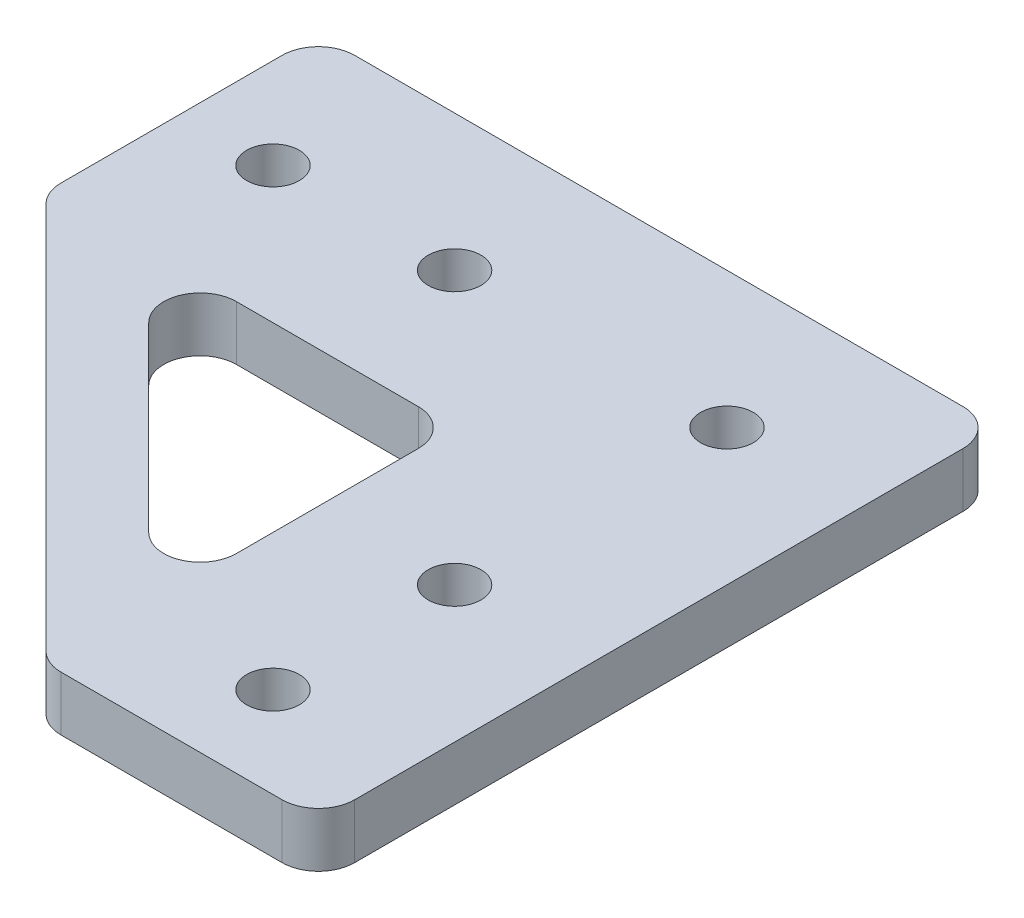
ISO-10303-21;
HEADER;
FILE_DESCRIPTION(('STEP AP214'),'2;1');
FILE_NAME('part.step','',(''),(''),'','','');
FILE_SCHEMA(('AUTOMOTIVE_DESIGN { 1 0 10303 214 1 1 1 1 }'));
ENDSEC;
DATA;
#1=APPLICATION_CONTEXT('core data for automotive mechanical design processes');
#2=APPLICATION_PROTOCOL_DEFINITION('international standard','automotive_design',2000,#1);
#3=PRODUCT_CONTEXT('',#1,'mechanical');
#4=PRODUCT('Part','Part','',(#3));
#5=PRODUCT_RELATED_PRODUCT_CATEGORY('part','',(#4));
#6=PRODUCT_DEFINITION_FORMATION('','',#4);
#7=PRODUCT_DEFINITION_CONTEXT('part definition',#1,'design');
#8=PRODUCT_DEFINITION('design','',#6,#7);
#9=PRODUCT_DEFINITION_SHAPE('','',#8);
#10=(LENGTH_UNIT() NAMED_UNIT(*) SI_UNIT(.MILLI.,.METRE.));
#11=(NAMED_UNIT(*) PLANE_ANGLE_UNIT() SI_UNIT($,.RADIAN.));
#12=(NAMED_UNIT(*) SI_UNIT($,.STERADIAN.) SOLID_ANGLE_UNIT());
#13=UNCERTAINTY_MEASURE_WITH_UNIT(LENGTH_MEASURE(1.E-05),#10,'distance_accuracy_value','');
#14=(GEOMETRIC_REPRESENTATION_CONTEXT(3) GLOBAL_UNCERTAINTY_ASSIGNED_CONTEXT((#13)) GLOBAL_UNIT_ASSIGNED_CONTEXT((#10,
#11,#12)) REPRESENTATION_CONTEXT('',''));
#15=CARTESIAN_POINT('',(0.,0.,0.));
#16=DIRECTION('',(0.,0.,1.));
#17=DIRECTION('',(1.,0.,0.));
#18=AXIS2_PLACEMENT_3D('',#15,#16,#17);
#19=CARTESIAN_POINT('',(0.,3.,0.));
#20=DIRECTION('',(0.,-1.,0.));
#21=DIRECTION('',(0.,0.,-1.));
#22=AXIS2_PLACEMENT_3D('',#19,#20,#21);
#23=PLANE('',#22);
#24=DIRECTION('',(0.,0.,1.));
#25=VECTOR('',#24,1.);
#26=CARTESIAN_POINT('',(-15.,3.,37.5));
#27=LINE('',#26,#25);
#28=CARTESIAN_POINT('',(-15.,3.,17.));
#29=VERTEX_POINT('',#28);
#30=CARTESIAN_POINT('',(-15.,3.,27.0147186257614));
#31=VERTEX_POINT('',#30);
#32=EDGE_CURVE('E307',#29,#31,#27,.T.);
#33=ORIENTED_EDGE('',*,*,#32,.T.);
#34=CARTESIAN_POINT('',(-17.,3.,27.0147186257614));
#35=DIRECTION('',(0.,-1.,0.));
#36=DIRECTION('',(0.,0.,-1.));
#37=AXIS2_PLACEMENT_3D('',#34,#35,#36);
#38=CIRCLE('',#37,2.);
#39=CARTESIAN_POINT('',(-18.4142135623731,3.,28.4289321881345));
#40=VERTEX_POINT('',#39);
#41=EDGE_CURVE('E275',#31,#40,#38,.T.);
#42=ORIENTED_EDGE('',*,*,#41,.T.);
#43=DIRECTION('',(-0.707106781186548,0.,-0.707106781186547));
#44=VECTOR('',#43,1.);
#45=CARTESIAN_POINT('',(-15.,3.,31.8431457505076));
#46=LINE('',#45,#44);
#47=CARTESIAN_POINT('',(-28.4289321881345,3.,18.4142135623731));
#48=VERTEX_POINT('',#47);
#49=EDGE_CURVE('E345',#40,#48,#46,.T.);
#50=ORIENTED_EDGE('',*,*,#49,.T.);
#51=CARTESIAN_POINT('',(-27.0147186257614,3.,17.));
#52=DIRECTION('',(0.,-1.,0.));
#53=DIRECTION('',(0.,0.,-1.));
#54=AXIS2_PLACEMENT_3D('',#51,#52,#53);
#55=CIRCLE('',#54,2.);
#56=CARTESIAN_POINT('',(-27.0147186257614,3.,15.));
#57=VERTEX_POINT('',#56);
#58=EDGE_CURVE('E281',#48,#57,#55,.T.);
#59=ORIENTED_EDGE('',*,*,#58,.T.);
#60=DIRECTION('',(1.,0.,0.));
#61=VECTOR('',#60,1.);
#62=CARTESIAN_POINT('',(-37.5,3.,15.));
#63=LINE('',#62,#61);
#64=CARTESIAN_POINT('',(-17.,3.,15.));
#65=VERTEX_POINT('',#64);
#66=EDGE_CURVE('E308',#57,#65,#63,.T.);
#67=ORIENTED_EDGE('',*,*,#66,.T.);
#68=CARTESIAN_POINT('',(-17.,3.,17.));
#69=DIRECTION('',(0.,-1.,0.));
#70=DIRECTION('',(0.,0.,-1.));
#71=AXIS2_PLACEMENT_3D('',#68,#69,#70);
#72=CIRCLE('',#71,2.);
#73=EDGE_CURVE('E11',#65,#29,#72,.T.);
#74=ORIENTED_EDGE('',*,*,#73,.T.);
#75=EDGE_LOOP('',(#33,#42,#50,#59,#67,#74));
#76=FACE_BOUND('',#75,.T.);
#77=DIRECTION('',(0.707106781186548,0.,0.707106781186547));
#78=VECTOR('',#77,1.);
#79=CARTESIAN_POINT('',(-37.5,3.,15.));
#80=LINE('',#79,#78);
#81=CARTESIAN_POINT('',(-36.9142135623731,3.,15.5857864376269));
#82=VERTEX_POINT('',#81);
#83=CARTESIAN_POINT('',(-15.5857864376269,3.,36.9142135623731));
#84=VERTEX_POINT('',#83);
#85=EDGE_CURVE('E341',#82,#84,#80,.T.);
#86=ORIENTED_EDGE('',*,*,#85,.T.);
#87=CARTESIAN_POINT('',(-14.1715728752538,3.,35.5));
#88=DIRECTION('',(0.,-1.,0.));
#89=DIRECTION('',(0.,0.,-1.));
#90=AXIS2_PLACEMENT_3D('',#87,#88,#89);
#91=CIRCLE('',#90,2.);
#92=CARTESIAN_POINT('',(-14.1715728752538,3.,37.5));
#93=VERTEX_POINT('',#92);
#94=EDGE_CURVE('E231',#84,#93,#91,.F.);
#95=ORIENTED_EDGE('',*,*,#94,.T.);
#96=DIRECTION('',(1.,0.,0.));
#97=VECTOR('',#96,1.);
#98=CARTESIAN_POINT('',(0.,3.,37.5));
#99=LINE('',#98,#97);
#100=CARTESIAN_POINT('',(-1.99999999999999,3.,37.5));
#101=VERTEX_POINT('',#100);
#102=EDGE_CURVE('E181',#93,#101,#99,.T.);
#103=ORIENTED_EDGE('',*,*,#102,.T.);
#104=CARTESIAN_POINT('',(-2.,3.,35.5));
#105=DIRECTION('',(0.,-1.,0.));
#106=DIRECTION('',(0.,0.,-1.));
#107=AXIS2_PLACEMENT_3D('',#104,#105,#106);
#108=CIRCLE('',#107,2.);
#109=CARTESIAN_POINT('',(0.,3.,35.5));
#110=VERTEX_POINT('',#109);
#111=EDGE_CURVE('E220',#101,#110,#108,.F.);
#112=ORIENTED_EDGE('',*,*,#111,.T.);
#113=DIRECTION('',(0.,0.,-1.));
#114=VECTOR('',#113,1.);
#115=CARTESIAN_POINT('',(0.,3.,0.));
#116=LINE('',#115,#114);
#117=CARTESIAN_POINT('',(0.,3.,2.));
#118=VERTEX_POINT('',#117);
#119=EDGE_CURVE('E190',#110,#118,#116,.T.);
#120=ORIENTED_EDGE('',*,*,#119,.T.);
#121=CARTESIAN_POINT('',(-2.,3.,2.));
#122=DIRECTION('',(0.,-1.,0.));
#123=DIRECTION('',(0.,0.,-1.));
#124=AXIS2_PLACEMENT_3D('',#121,#122,#123);
#125=CIRCLE('',#124,2.);
#126=CARTESIAN_POINT('',(-2.,3.,0.));
#127=VERTEX_POINT('',#126);
#128=EDGE_CURVE('E223',#118,#127,#125,.F.);
#129=ORIENTED_EDGE('',*,*,#128,.T.);
#130=DIRECTION('',(-1.,0.,0.));
#131=VECTOR('',#130,1.);
#132=CARTESIAN_POINT('',(0.,3.,0.));
#133=LINE('',#132,#131);
#134=CARTESIAN_POINT('',(-35.5,3.,0.));
#135=VERTEX_POINT('',#134);
#136=EDGE_CURVE('E196',#127,#135,#133,.T.);
#137=ORIENTED_EDGE('',*,*,#136,.T.);
#138=CARTESIAN_POINT('',(-35.5,3.,2.));
#139=DIRECTION('',(0.,-1.,0.));
#140=DIRECTION('',(0.,0.,-1.));
#141=AXIS2_PLACEMENT_3D('',#138,#139,#140);
#142=CIRCLE('',#141,2.);
#143=CARTESIAN_POINT('',(-37.5,3.,2.));
#144=VERTEX_POINT('',#143);
#145=EDGE_CURVE('E68',#135,#144,#142,.F.);
#146=ORIENTED_EDGE('',*,*,#145,.T.);
#147=DIRECTION('',(0.,0.,1.));
#148=VECTOR('',#147,1.);
#149=CARTESIAN_POINT('',(-37.5,3.,0.));
#150=LINE('',#149,#148);
#151=CARTESIAN_POINT('',(-37.5,3.,14.1715728752538));
#152=VERTEX_POINT('',#151);
#153=EDGE_CURVE('E317',#144,#152,#150,.T.);
#154=ORIENTED_EDGE('',*,*,#153,.T.);
#155=CARTESIAN_POINT('',(-35.5,3.,14.1715728752538));
#156=DIRECTION('',(0.,-1.,0.));
#157=DIRECTION('',(0.,0.,-1.));
#158=AXIS2_PLACEMENT_3D('',#155,#156,#157);
#159=CIRCLE('',#158,2.);
#160=EDGE_CURVE('E228',#152,#82,#159,.F.);
#161=ORIENTED_EDGE('',*,*,#160,.T.);
#162=EDGE_LOOP('',(#86,#95,#103,#112,#120,#129,#137,#146,#154,#161));
#163=FACE_BOUND('',#162,.T.);
#164=CARTESIAN_POINT('',(-7.50000000000001,3.,7.5));
#165=DIRECTION('',(0.,1.,0.));
#166=DIRECTION('',(0.,0.,1.));
#167=AXIS2_PLACEMENT_3D('',#164,#165,#166);
#168=CIRCLE('',#167,1.45);
#169=CARTESIAN_POINT('',(-7.50000000000001,3.,8.95));
#170=VERTEX_POINT('',#169);
#171=EDGE_CURVE('E326',#170,#170,#168,.T.);
#172=ORIENTED_EDGE('',*,*,#171,.F.);
#173=EDGE_LOOP('',(#172));
#174=FACE_BOUND('',#173,.T.);
#175=CARTESIAN_POINT('',(-22.5,3.,7.5));
#176=DIRECTION('',(0.,1.,0.));
#177=DIRECTION('',(0.,0.,1.));
#178=AXIS2_PLACEMENT_3D('',#175,#176,#177);
#179=CIRCLE('',#178,1.45);
#180=CARTESIAN_POINT('',(-22.5,3.,8.95));
#181=VERTEX_POINT('',#180);
#182=EDGE_CURVE('E380',#181,#181,#179,.T.);
#183=ORIENTED_EDGE('',*,*,#182,.F.);
#184=EDGE_LOOP('',(#183));
#185=FACE_BOUND('',#184,.T.);
#186=CARTESIAN_POINT('',(-32.5,3.,7.5));
#187=DIRECTION('',(0.,1.,0.));
#188=DIRECTION('',(0.,0.,1.));
#189=AXIS2_PLACEMENT_3D('',#186,#187,#188);
#190=CIRCLE('',#189,1.45);
#191=CARTESIAN_POINT('',(-32.5,3.,8.95));
#192=VERTEX_POINT('',#191);
#193=EDGE_CURVE('E372',#192,#192,#190,.T.);
#194=ORIENTED_EDGE('',*,*,#193,.F.);
#195=EDGE_LOOP('',(#194));
#196=FACE_BOUND('',#195,.T.);
#197=CARTESIAN_POINT('',(-7.5,3.,22.5));
#198=DIRECTION('',(0.,1.,0.));
#199=DIRECTION('',(0.,0.,1.));
#200=AXIS2_PLACEMENT_3D('',#197,#198,#199);
#201=CIRCLE('',#200,1.45);
#202=CARTESIAN_POINT('',(-7.5,3.,23.95));
#203=VERTEX_POINT('',#202);
#204=EDGE_CURVE('E364',#203,#203,#201,.T.);
#205=ORIENTED_EDGE('',*,*,#204,.F.);
#206=EDGE_LOOP('',(#205));
#207=FACE_BOUND('',#206,.T.);
#208=CARTESIAN_POINT('',(-7.5,3.,32.5));
#209=DIRECTION('',(0.,1.,0.));
#210=DIRECTION('',(0.,0.,1.));
#211=AXIS2_PLACEMENT_3D('',#208,#209,#210);
#212=CIRCLE('',#211,1.45);
#213=CARTESIAN_POINT('',(-7.5,3.,33.95));
#214=VERTEX_POINT('',#213);
#215=EDGE_CURVE('E355',#214,#214,#212,.T.);
#216=ORIENTED_EDGE('',*,*,#215,.F.);
#217=EDGE_LOOP('',(#216));
#218=FACE_BOUND('',#217,.T.);
#219=ADVANCED_FACE('F45',(#76,#163,#174,#185,#196,#207,#218),#23,.F.);
#220=CARTESIAN_POINT('',(0.,0.,0.));
#221=DIRECTION('',(0.,-1.,0.));
#222=DIRECTION('',(0.,0.,-1.));
#223=AXIS2_PLACEMENT_3D('',#220,#221,#222);
#224=PLANE('',#223);
#225=DIRECTION('',(1.,0.,0.));
#226=VECTOR('',#225,1.);
#227=CARTESIAN_POINT('',(-37.5,0.,15.));
#228=LINE('',#227,#226);
#229=CARTESIAN_POINT('',(-27.0147186257614,0.,15.));
#230=VERTEX_POINT('',#229);
#231=CARTESIAN_POINT('',(-17.,0.,15.));
#232=VERTEX_POINT('',#231);
#233=EDGE_CURVE('E199',#230,#232,#228,.T.);
#234=ORIENTED_EDGE('',*,*,#233,.F.);
#235=CARTESIAN_POINT('',(-27.0147186257614,0.,17.));
#236=DIRECTION('',(0.,-1.,0.));
#237=DIRECTION('',(0.,0.,-1.));
#238=AXIS2_PLACEMENT_3D('',#235,#236,#237);
#239=CIRCLE('',#238,2.);
#240=CARTESIAN_POINT('',(-28.4289321881345,0.,18.4142135623731));
#241=VERTEX_POINT('',#240);
#242=EDGE_CURVE('E284',#230,#241,#239,.F.);
#243=ORIENTED_EDGE('',*,*,#242,.T.);
#244=DIRECTION('',(-0.707106781186548,0.,-0.707106781186547));
#245=VECTOR('',#244,1.);
#246=CARTESIAN_POINT('',(-15.,0.,31.8431457505076));
#247=LINE('',#246,#245);
#248=CARTESIAN_POINT('',(-18.4142135623731,0.,28.4289321881345));
#249=VERTEX_POINT('',#248);
#250=EDGE_CURVE('E352',#249,#241,#247,.T.);
#251=ORIENTED_EDGE('',*,*,#250,.F.);
#252=CARTESIAN_POINT('',(-17.,0.,27.0147186257614));
#253=DIRECTION('',(0.,-1.,0.));
#254=DIRECTION('',(0.,0.,-1.));
#255=AXIS2_PLACEMENT_3D('',#252,#253,#254);
#256=CIRCLE('',#255,2.);
#257=CARTESIAN_POINT('',(-15.,0.,27.0147186257614));
#258=VERTEX_POINT('',#257);
#259=EDGE_CURVE('E278',#249,#258,#256,.F.);
#260=ORIENTED_EDGE('',*,*,#259,.T.);
#261=DIRECTION('',(0.,0.,1.));
#262=VECTOR('',#261,1.);
#263=CARTESIAN_POINT('',(-15.,0.,37.5));
#264=LINE('',#263,#262);
#265=CARTESIAN_POINT('',(-15.,0.,17.));
#266=VERTEX_POINT('',#265);
#267=EDGE_CURVE('E191',#266,#258,#264,.T.);
#268=ORIENTED_EDGE('',*,*,#267,.F.);
#269=CARTESIAN_POINT('',(-17.,0.,17.));
#270=DIRECTION('',(0.,-1.,0.));
#271=DIRECTION('',(0.,0.,-1.));
#272=AXIS2_PLACEMENT_3D('',#269,#270,#271);
#273=CIRCLE('',#272,2.);
#274=EDGE_CURVE('E54',#266,#232,#273,.F.);
#275=ORIENTED_EDGE('',*,*,#274,.T.);
#276=EDGE_LOOP('',(#234,#243,#251,#260,#268,#275));
#277=FACE_BOUND('',#276,.T.);
#278=CARTESIAN_POINT('',(-7.5,0.,22.5));
#279=DIRECTION('',(0.,1.,0.));
#280=DIRECTION('',(0.,0.,1.));
#281=AXIS2_PLACEMENT_3D('',#278,#279,#280);
#282=CIRCLE('',#281,1.45);
#283=CARTESIAN_POINT('',(-7.5,0.,23.95));
#284=VERTEX_POINT('',#283);
#285=EDGE_CURVE('E359',#284,#284,#282,.T.);
#286=ORIENTED_EDGE('',*,*,#285,.T.);
#287=EDGE_LOOP('',(#286));
#288=FACE_BOUND('',#287,.T.);
#289=CARTESIAN_POINT('',(-22.5,0.,7.5));
#290=DIRECTION('',(0.,1.,0.));
#291=DIRECTION('',(0.,0.,1.));
#292=AXIS2_PLACEMENT_3D('',#289,#290,#291);
#293=CIRCLE('',#292,1.45);
#294=CARTESIAN_POINT('',(-22.5,0.,8.95));
#295=VERTEX_POINT('',#294);
#296=EDGE_CURVE('E376',#295,#295,#293,.T.);
#297=ORIENTED_EDGE('',*,*,#296,.T.);
#298=EDGE_LOOP('',(#297));
#299=FACE_BOUND('',#298,.T.);
#300=DIRECTION('',(1.,0.,0.));
#301=VECTOR('',#300,1.);
#302=CARTESIAN_POINT('',(0.,0.,37.5));
#303=LINE('',#302,#301);
#304=CARTESIAN_POINT('',(-14.1715728752538,0.,37.5));
#305=VERTEX_POINT('',#304);
#306=CARTESIAN_POINT('',(-1.99999999999999,0.,37.5));
#307=VERTEX_POINT('',#306);
#308=EDGE_CURVE('E178',#305,#307,#303,.T.);
#309=ORIENTED_EDGE('',*,*,#308,.F.);
#310=CARTESIAN_POINT('',(-14.1715728752538,0.,35.5));
#311=DIRECTION('',(0.,-1.,0.));
#312=DIRECTION('',(0.,0.,-1.));
#313=AXIS2_PLACEMENT_3D('',#310,#311,#312);
#314=CIRCLE('',#313,2.);
#315=CARTESIAN_POINT('',(-15.5857864376269,0.,36.9142135623731));
#316=VERTEX_POINT('',#315);
#317=EDGE_CURVE('E160',#305,#316,#314,.T.);
#318=ORIENTED_EDGE('',*,*,#317,.T.);
#319=DIRECTION('',(0.707106781186548,0.,0.707106781186547));
#320=VECTOR('',#319,1.);
#321=CARTESIAN_POINT('',(-37.5,0.,15.));
#322=LINE('',#321,#320);
#323=CARTESIAN_POINT('',(-36.9142135623731,0.,15.5857864376269));
#324=VERTEX_POINT('',#323);
#325=EDGE_CURVE('E349',#324,#316,#322,.T.);
#326=ORIENTED_EDGE('',*,*,#325,.F.);
#327=CARTESIAN_POINT('',(-35.5,0.,14.1715728752538));
#328=DIRECTION('',(0.,-1.,0.));
#329=DIRECTION('',(0.,0.,-1.));
#330=AXIS2_PLACEMENT_3D('',#327,#328,#329);
#331=CIRCLE('',#330,2.);
#332=CARTESIAN_POINT('',(-37.5,0.,14.1715728752538));
#333=VERTEX_POINT('',#332);
#334=EDGE_CURVE('E172',#324,#333,#331,.T.);
#335=ORIENTED_EDGE('',*,*,#334,.T.);
#336=DIRECTION('',(0.,0.,1.));
#337=VECTOR('',#336,1.);
#338=CARTESIAN_POINT('',(-37.5,0.,0.));
#339=LINE('',#338,#337);
#340=CARTESIAN_POINT('',(-37.5,0.,2.));
#341=VERTEX_POINT('',#340);
#342=EDGE_CURVE('E302',#341,#333,#339,.T.);
#343=ORIENTED_EDGE('',*,*,#342,.F.);
#344=CARTESIAN_POINT('',(-35.5,0.,2.));
#345=DIRECTION('',(0.,-1.,0.));
#346=DIRECTION('',(0.,0.,-1.));
#347=AXIS2_PLACEMENT_3D('',#344,#345,#346);
#348=CIRCLE('',#347,2.);
#349=CARTESIAN_POINT('',(-35.5,0.,0.));
#350=VERTEX_POINT('',#349);
#351=EDGE_CURVE('E210',#341,#350,#348,.T.);
#352=ORIENTED_EDGE('',*,*,#351,.T.);
#353=DIRECTION('',(-1.,0.,0.));
#354=VECTOR('',#353,1.);
#355=CARTESIAN_POINT('',(0.,0.,0.));
#356=LINE('',#355,#354);
#357=CARTESIAN_POINT('',(-2.,0.,0.));
#358=VERTEX_POINT('',#357);
#359=EDGE_CURVE('E325',#358,#350,#356,.T.);
#360=ORIENTED_EDGE('',*,*,#359,.F.);
#361=CARTESIAN_POINT('',(-2.,0.,2.));
#362=DIRECTION('',(0.,-1.,0.));
#363=DIRECTION('',(0.,0.,-1.));
#364=AXIS2_PLACEMENT_3D('',#361,#362,#363);
#365=CIRCLE('',#364,2.);
#366=CARTESIAN_POINT('',(0.,0.,2.));
#367=VERTEX_POINT('',#366);
#368=EDGE_CURVE('E207',#358,#367,#365,.T.);
#369=ORIENTED_EDGE('',*,*,#368,.T.);
#370=DIRECTION('',(0.,0.,-1.));
#371=VECTOR('',#370,1.);
#372=CARTESIAN_POINT('',(0.,0.,0.));
#373=LINE('',#372,#371);
#374=CARTESIAN_POINT('',(0.,0.,35.5));
#375=VERTEX_POINT('',#374);
#376=EDGE_CURVE('E321',#375,#367,#373,.T.);
#377=ORIENTED_EDGE('',*,*,#376,.F.);
#378=CARTESIAN_POINT('',(-2.,0.,35.5));
#379=DIRECTION('',(0.,-1.,0.));
#380=DIRECTION('',(0.,0.,-1.));
#381=AXIS2_PLACEMENT_3D('',#378,#379,#380);
#382=CIRCLE('',#381,2.);
#383=EDGE_CURVE('E183',#375,#307,#382,.T.);
#384=ORIENTED_EDGE('',*,*,#383,.T.);
#385=EDGE_LOOP('',(#309,#318,#326,#335,#343,#352,#360,#369,#377,#384));
#386=FACE_BOUND('',#385,.T.);
#387=CARTESIAN_POINT('',(-7.50000000000001,0.,7.5));
#388=DIRECTION('',(0.,1.,0.));
#389=DIRECTION('',(0.,0.,1.));
#390=AXIS2_PLACEMENT_3D('',#387,#388,#389);
#391=CIRCLE('',#390,1.45);
#392=CARTESIAN_POINT('',(-7.50000000000001,0.,8.95));
#393=VERTEX_POINT('',#392);
#394=EDGE_CURVE('E384',#393,#393,#391,.T.);
#395=ORIENTED_EDGE('',*,*,#394,.T.);
#396=EDGE_LOOP('',(#395));
#397=FACE_BOUND('',#396,.T.);
#398=CARTESIAN_POINT('',(-32.5,0.,7.5));
#399=DIRECTION('',(0.,1.,0.));
#400=DIRECTION('',(0.,0.,1.));
#401=AXIS2_PLACEMENT_3D('',#398,#399,#400);
#402=CIRCLE('',#401,1.45);
#403=CARTESIAN_POINT('',(-32.5,0.,8.95));
#404=VERTEX_POINT('',#403);
#405=EDGE_CURVE('E368',#404,#404,#402,.T.);
#406=ORIENTED_EDGE('',*,*,#405,.T.);
#407=EDGE_LOOP('',(#406));
#408=FACE_BOUND('',#407,.T.);
#409=CARTESIAN_POINT('',(-7.5,0.,32.5));
#410=DIRECTION('',(0.,1.,0.));
#411=DIRECTION('',(0.,0.,1.));
#412=AXIS2_PLACEMENT_3D('',#409,#410,#411);
#413=CIRCLE('',#412,1.45);
#414=CARTESIAN_POINT('',(-7.5,0.,33.95));
#415=VERTEX_POINT('',#414);
#416=EDGE_CURVE('E360',#415,#415,#413,.T.);
#417=ORIENTED_EDGE('',*,*,#416,.T.);
#418=EDGE_LOOP('',(#417));
#419=FACE_BOUND('',#418,.T.);
#420=ADVANCED_FACE('F186',(#277,#288,#299,#386,#397,#408,#419),#224,.T.);
#421=CARTESIAN_POINT('',(0.,3.,0.));
#422=DIRECTION('',(-1.,0.,0.));
#423=DIRECTION('',(0.,0.,1.));
#424=AXIS2_PLACEMENT_3D('',#421,#422,#423);
#425=PLANE('',#424);
#426=ORIENTED_EDGE('',*,*,#376,.T.);
#427=DIRECTION('',(0.,-1.,0.));
#428=VECTOR('',#427,1.);
#429=CARTESIAN_POINT('',(0.,3.,2.));
#430=LINE('',#429,#428);
#431=EDGE_CURVE('E251',#367,#118,#430,.F.);
#432=ORIENTED_EDGE('',*,*,#431,.T.);
#433=ORIENTED_EDGE('',*,*,#119,.F.);
#434=DIRECTION('',(0.,-1.,0.));
#435=VECTOR('',#434,1.);
#436=CARTESIAN_POINT('',(0.,3.,35.5));
#437=LINE('',#436,#435);
#438=EDGE_CURVE('E247',#110,#375,#437,.T.);
#439=ORIENTED_EDGE('',*,*,#438,.T.);
#440=EDGE_LOOP('',(#426,#432,#433,#439));
#441=FACE_BOUND('',#440,.T.);
#442=ADVANCED_FACE('F409',(#441),#425,.F.);
#443=CARTESIAN_POINT('',(0.,3.,0.));
#444=DIRECTION('',(0.,0.,1.));
#445=DIRECTION('',(1.,0.,0.));
#446=AXIS2_PLACEMENT_3D('',#443,#444,#445);
#447=PLANE('',#446);
#448=ORIENTED_EDGE('',*,*,#359,.T.);
#449=DIRECTION('',(0.,-1.,0.));
#450=VECTOR('',#449,1.);
#451=CARTESIAN_POINT('',(-35.5,3.,0.));
#452=LINE('',#451,#450);
#453=EDGE_CURVE('E244',#350,#135,#452,.F.);
#454=ORIENTED_EDGE('',*,*,#453,.T.);
#455=ORIENTED_EDGE('',*,*,#136,.F.);
#456=DIRECTION('',(0.,-1.,0.));
#457=VECTOR('',#456,1.);
#458=CARTESIAN_POINT('',(-2.,3.,0.));
#459=LINE('',#458,#457);
#460=EDGE_CURVE('E240',#127,#358,#459,.T.);
#461=ORIENTED_EDGE('',*,*,#460,.T.);
#462=EDGE_LOOP('',(#448,#454,#455,#461));
#463=FACE_BOUND('',#462,.T.);
#464=ADVANCED_FACE('F404',(#463),#447,.F.);
#465=CARTESIAN_POINT('',(-37.5,3.,0.));
#466=DIRECTION('',(1.,0.,0.));
#467=DIRECTION('',(0.,0.,-1.));
#468=AXIS2_PLACEMENT_3D('',#465,#466,#467);
#469=PLANE('',#468);
#470=ORIENTED_EDGE('',*,*,#342,.T.);
#471=DIRECTION('',(0.,-1.,0.));
#472=VECTOR('',#471,1.);
#473=CARTESIAN_POINT('',(-37.5,3.,14.1715728752538));
#474=LINE('',#473,#472);
#475=EDGE_CURVE('E61',#333,#152,#474,.F.);
#476=ORIENTED_EDGE('',*,*,#475,.T.);
#477=ORIENTED_EDGE('',*,*,#153,.F.);
#478=DIRECTION('',(0.,-1.,0.));
#479=VECTOR('',#478,1.);
#480=CARTESIAN_POINT('',(-37.5,3.,2.));
#481=LINE('',#480,#479);
#482=EDGE_CURVE('E234',#144,#341,#481,.T.);
#483=ORIENTED_EDGE('',*,*,#482,.T.);
#484=EDGE_LOOP('',(#470,#476,#477,#483));
#485=FACE_BOUND('',#484,.T.);
#486=ADVANCED_FACE('F332',(#485),#469,.F.);
#487=CARTESIAN_POINT('',(-37.5,3.,15.));
#488=DIRECTION('',(0.,0.,-1.));
#489=DIRECTION('',(-1.,0.,0.));
#490=AXIS2_PLACEMENT_3D('',#487,#488,#489);
#491=PLANE('',#490);
#492=ORIENTED_EDGE('',*,*,#66,.F.);
#493=DIRECTION('',(0.,1.,0.));
#494=VECTOR('',#493,1.);
#495=CARTESIAN_POINT('',(-27.0147186257614,3.,15.));
#496=LINE('',#495,#494);
#497=EDGE_CURVE('E272',#57,#230,#496,.F.);
#498=ORIENTED_EDGE('',*,*,#497,.T.);
#499=ORIENTED_EDGE('',*,*,#233,.T.);
#500=DIRECTION('',(0.,-1.,0.));
#501=VECTOR('',#500,1.);
#502=CARTESIAN_POINT('',(-17.,3.,15.));
#503=LINE('',#502,#501);
#504=EDGE_CURVE('E269',#232,#65,#503,.F.);
#505=ORIENTED_EDGE('',*,*,#504,.T.);
#506=EDGE_LOOP('',(#492,#498,#499,#505));
#507=FACE_BOUND('',#506,.T.);
#508=ADVANCED_FACE('F298',(#507),#491,.F.);
#509=CARTESIAN_POINT('',(-15.,3.,37.5));
#510=DIRECTION('',(1.,0.,0.));
#511=DIRECTION('',(0.,0.,-1.));
#512=AXIS2_PLACEMENT_3D('',#509,#510,#511);
#513=PLANE('',#512);
#514=ORIENTED_EDGE('',*,*,#267,.T.);
#515=DIRECTION('',(0.,1.,0.));
#516=VECTOR('',#515,1.);
#517=CARTESIAN_POINT('',(-15.,3.,27.0147186257614));
#518=LINE('',#517,#516);
#519=EDGE_CURVE('E258',#258,#31,#518,.T.);
#520=ORIENTED_EDGE('',*,*,#519,.T.);
#521=ORIENTED_EDGE('',*,*,#32,.F.);
#522=DIRECTION('',(0.,-1.,0.));
#523=VECTOR('',#522,1.);
#524=CARTESIAN_POINT('',(-15.,0.,17.));
#525=LINE('',#524,#523);
#526=EDGE_CURVE('E254',#29,#266,#525,.T.);
#527=ORIENTED_EDGE('',*,*,#526,.T.);
#528=EDGE_LOOP('',(#514,#520,#521,#527));
#529=FACE_BOUND('',#528,.T.);
#530=ADVANCED_FACE('F310',(#529),#513,.F.);
#531=CARTESIAN_POINT('',(0.,3.,37.5));
#532=DIRECTION('',(0.,0.,-1.));
#533=DIRECTION('',(-1.,0.,0.));
#534=AXIS2_PLACEMENT_3D('',#531,#532,#533);
#535=PLANE('',#534);
#536=ORIENTED_EDGE('',*,*,#102,.F.);
#537=DIRECTION('',(0.,-1.,0.));
#538=VECTOR('',#537,1.);
#539=CARTESIAN_POINT('',(-14.1715728752538,0.,37.5));
#540=LINE('',#539,#538);
#541=EDGE_CURVE('E164',#93,#305,#540,.T.);
#542=ORIENTED_EDGE('',*,*,#541,.T.);
#543=ORIENTED_EDGE('',*,*,#308,.T.);
#544=DIRECTION('',(0.,-1.,0.));
#545=VECTOR('',#544,1.);
#546=CARTESIAN_POINT('',(-2.,3.,37.5));
#547=LINE('',#546,#545);
#548=EDGE_CURVE('E184',#307,#101,#547,.F.);
#549=ORIENTED_EDGE('',*,*,#548,.T.);
#550=EDGE_LOOP('',(#536,#542,#543,#549));
#551=FACE_BOUND('',#550,.T.);
#552=ADVANCED_FACE('F177',(#551),#535,.F.);
#553=CARTESIAN_POINT('',(-7.50000000000001,3.,7.5));
#554=DIRECTION('',(0.,-1.,0.));
#555=DIRECTION('',(0.,0.,-1.));
#556=AXIS2_PLACEMENT_3D('',#553,#554,#555);
#557=CYLINDRICAL_SURFACE('',#556,1.45);
#558=ORIENTED_EDGE('',*,*,#171,.T.);
#559=EDGE_LOOP('',(#558));
#560=FACE_BOUND('',#559,.T.);
#561=ORIENTED_EDGE('',*,*,#394,.F.);
#562=EDGE_LOOP('',(#561));
#563=FACE_BOUND('',#562,.T.);
#564=ADVANCED_FACE('F434',(#560,#563),#557,.F.);
#565=CARTESIAN_POINT('',(-22.5,3.,7.5));
#566=DIRECTION('',(0.,-1.,0.));
#567=DIRECTION('',(0.,0.,-1.));
#568=AXIS2_PLACEMENT_3D('',#565,#566,#567);
#569=CYLINDRICAL_SURFACE('',#568,1.45);
#570=ORIENTED_EDGE('',*,*,#182,.T.);
#571=EDGE_LOOP('',(#570));
#572=FACE_BOUND('',#571,.T.);
#573=ORIENTED_EDGE('',*,*,#296,.F.);
#574=EDGE_LOOP('',(#573));
#575=FACE_BOUND('',#574,.T.);
#576=ADVANCED_FACE('F518',(#572,#575),#569,.F.);
#577=CARTESIAN_POINT('',(-32.5,3.,7.5));
#578=DIRECTION('',(0.,-1.,0.));
#579=DIRECTION('',(0.,0.,-1.));
#580=AXIS2_PLACEMENT_3D('',#577,#578,#579);
#581=CYLINDRICAL_SURFACE('',#580,1.45);
#582=ORIENTED_EDGE('',*,*,#193,.T.);
#583=EDGE_LOOP('',(#582));
#584=FACE_BOUND('',#583,.T.);
#585=ORIENTED_EDGE('',*,*,#405,.F.);
#586=EDGE_LOOP('',(#585));
#587=FACE_BOUND('',#586,.T.);
#588=ADVANCED_FACE('F515',(#584,#587),#581,.F.);
#589=CARTESIAN_POINT('',(-7.5,3.,22.5));
#590=DIRECTION('',(0.,-1.,0.));
#591=DIRECTION('',(0.,0.,-1.));
#592=AXIS2_PLACEMENT_3D('',#589,#590,#591);
#593=CYLINDRICAL_SURFACE('',#592,1.45);
#594=ORIENTED_EDGE('',*,*,#204,.T.);
#595=EDGE_LOOP('',(#594));
#596=FACE_BOUND('',#595,.T.);
#597=ORIENTED_EDGE('',*,*,#285,.F.);
#598=EDGE_LOOP('',(#597));
#599=FACE_BOUND('',#598,.T.);
#600=ADVANCED_FACE('F509',(#596,#599),#593,.F.);
#601=CARTESIAN_POINT('',(-7.5,3.,32.5));
#602=DIRECTION('',(0.,-1.,0.));
#603=DIRECTION('',(0.,0.,-1.));
#604=AXIS2_PLACEMENT_3D('',#601,#602,#603);
#605=CYLINDRICAL_SURFACE('',#604,1.45);
#606=ORIENTED_EDGE('',*,*,#215,.T.);
#607=EDGE_LOOP('',(#606));
#608=FACE_BOUND('',#607,.T.);
#609=ORIENTED_EDGE('',*,*,#416,.F.);
#610=EDGE_LOOP('',(#609));
#611=FACE_BOUND('',#610,.T.);
#612=ADVANCED_FACE('F503',(#608,#611),#605,.F.);
#613=CARTESIAN_POINT('',(-15.,0.,31.8431457505076));
#614=DIRECTION('',(0.707106781186547,0.,-0.707106781186548));
#615=DIRECTION('',(-0.707106781186548,0.,-0.707106781186547));
#616=AXIS2_PLACEMENT_3D('',#613,#614,#615);
#617=PLANE('',#616);
#618=ORIENTED_EDGE('',*,*,#49,.F.);
#619=DIRECTION('',(0.,1.,0.));
#620=VECTOR('',#619,1.);
#621=CARTESIAN_POINT('',(-18.4142135623731,0.,28.4289321881345));
#622=LINE('',#621,#620);
#623=EDGE_CURVE('E266',#40,#249,#622,.F.);
#624=ORIENTED_EDGE('',*,*,#623,.T.);
#625=ORIENTED_EDGE('',*,*,#250,.T.);
#626=DIRECTION('',(0.,1.,0.));
#627=VECTOR('',#626,1.);
#628=CARTESIAN_POINT('',(-28.4289321881345,0.,18.4142135623731));
#629=LINE('',#628,#627);
#630=EDGE_CURVE('E262',#241,#48,#629,.T.);
#631=ORIENTED_EDGE('',*,*,#630,.T.);
#632=EDGE_LOOP('',(#618,#624,#625,#631));
#633=FACE_BOUND('',#632,.T.);
#634=ADVANCED_FACE('F498',(#633),#617,.T.);
#635=CARTESIAN_POINT('',(-37.5,0.,15.));
#636=DIRECTION('',(-0.707106781186547,0.,0.707106781186548));
#637=DIRECTION('',(0.707106781186548,0.,0.707106781186547));
#638=AXIS2_PLACEMENT_3D('',#635,#636,#637);
#639=PLANE('',#638);
#640=ORIENTED_EDGE('',*,*,#325,.T.);
#641=DIRECTION('',(0.,-1.,0.));
#642=VECTOR('',#641,1.);
#643=CARTESIAN_POINT('',(-15.5857864376269,3.,36.9142135623731));
#644=LINE('',#643,#642);
#645=EDGE_CURVE('E165',#316,#84,#644,.F.);
#646=ORIENTED_EDGE('',*,*,#645,.T.);
#647=ORIENTED_EDGE('',*,*,#85,.F.);
#648=DIRECTION('',(0.,-1.,0.));
#649=VECTOR('',#648,1.);
#650=CARTESIAN_POINT('',(-36.9142135623731,0.,15.5857864376269));
#651=LINE('',#650,#649);
#652=EDGE_CURVE('E171',#82,#324,#651,.T.);
#653=ORIENTED_EDGE('',*,*,#652,.T.);
#654=EDGE_LOOP('',(#640,#646,#647,#653));
#655=FACE_BOUND('',#654,.T.);
#656=ADVANCED_FACE('F343',(#655),#639,.T.);
#657=CARTESIAN_POINT('',(-14.1715728752538,3.,35.5));
#658=DIRECTION('',(0.,1.,0.));
#659=DIRECTION('',(0.,0.,1.));
#660=AXIS2_PLACEMENT_3D('',#657,#658,#659);
#661=CYLINDRICAL_SURFACE('',#660,2.);
#662=ORIENTED_EDGE('',*,*,#94,.F.);
#663=ORIENTED_EDGE('',*,*,#645,.F.);
#664=ORIENTED_EDGE('',*,*,#317,.F.);
#665=ORIENTED_EDGE('',*,*,#541,.F.);
#666=EDGE_LOOP('',(#662,#663,#664,#665));
#667=FACE_BOUND('',#666,.T.);
#668=ADVANCED_FACE('F163',(#667),#661,.T.);
#669=CARTESIAN_POINT('',(-35.5,0.,14.1715728752538));
#670=DIRECTION('',(0.,1.,0.));
#671=DIRECTION('',(0.,0.,1.));
#672=AXIS2_PLACEMENT_3D('',#669,#670,#671);
#673=CYLINDRICAL_SURFACE('',#672,2.);
#674=ORIENTED_EDGE('',*,*,#160,.F.);
#675=ORIENTED_EDGE('',*,*,#475,.F.);
#676=ORIENTED_EDGE('',*,*,#334,.F.);
#677=ORIENTED_EDGE('',*,*,#652,.F.);
#678=EDGE_LOOP('',(#674,#675,#676,#677));
#679=FACE_BOUND('',#678,.T.);
#680=ADVANCED_FACE('F336',(#679),#673,.T.);
#681=CARTESIAN_POINT('',(-35.5,3.,2.));
#682=DIRECTION('',(0.,-1.,0.));
#683=DIRECTION('',(0.,0.,-1.));
#684=AXIS2_PLACEMENT_3D('',#681,#682,#683);
#685=CYLINDRICAL_SURFACE('',#684,2.);
#686=ORIENTED_EDGE('',*,*,#145,.F.);
#687=ORIENTED_EDGE('',*,*,#453,.F.);
#688=ORIENTED_EDGE('',*,*,#351,.F.);
#689=ORIENTED_EDGE('',*,*,#482,.F.);
#690=EDGE_LOOP('',(#686,#687,#688,#689));
#691=FACE_BOUND('',#690,.T.);
#692=ADVANCED_FACE('F402',(#691),#685,.T.);
#693=CARTESIAN_POINT('',(-2.,3.,2.));
#694=DIRECTION('',(0.,-1.,0.));
#695=DIRECTION('',(0.,0.,-1.));
#696=AXIS2_PLACEMENT_3D('',#693,#694,#695);
#697=CYLINDRICAL_SURFACE('',#696,2.);
#698=ORIENTED_EDGE('',*,*,#128,.F.);
#699=ORIENTED_EDGE('',*,*,#431,.F.);
#700=ORIENTED_EDGE('',*,*,#368,.F.);
#701=ORIENTED_EDGE('',*,*,#460,.F.);
#702=EDGE_LOOP('',(#698,#699,#700,#701));
#703=FACE_BOUND('',#702,.T.);
#704=ADVANCED_FACE('F406',(#703),#697,.T.);
#705=CARTESIAN_POINT('',(-2.,3.,35.5));
#706=DIRECTION('',(0.,-1.,0.));
#707=DIRECTION('',(0.,0.,-1.));
#708=AXIS2_PLACEMENT_3D('',#705,#706,#707);
#709=CYLINDRICAL_SURFACE('',#708,2.);
#710=ORIENTED_EDGE('',*,*,#111,.F.);
#711=ORIENTED_EDGE('',*,*,#548,.F.);
#712=ORIENTED_EDGE('',*,*,#383,.F.);
#713=ORIENTED_EDGE('',*,*,#438,.F.);
#714=EDGE_LOOP('',(#710,#711,#712,#713));
#715=FACE_BOUND('',#714,.T.);
#716=ADVANCED_FACE('F414',(#715),#709,.T.);
#717=CARTESIAN_POINT('',(-17.,3.,27.0147186257614));
#718=DIRECTION('',(0.,1.,0.));
#719=DIRECTION('',(0.,0.,1.));
#720=AXIS2_PLACEMENT_3D('',#717,#718,#719);
#721=CYLINDRICAL_SURFACE('',#720,2.);
#722=ORIENTED_EDGE('',*,*,#259,.F.);
#723=ORIENTED_EDGE('',*,*,#623,.F.);
#724=ORIENTED_EDGE('',*,*,#41,.F.);
#725=ORIENTED_EDGE('',*,*,#519,.F.);
#726=EDGE_LOOP('',(#722,#723,#724,#725));
#727=FACE_BOUND('',#726,.T.);
#728=ADVANCED_FACE('F416',(#727),#721,.F.);
#729=CARTESIAN_POINT('',(-27.0147186257614,0.,17.));
#730=DIRECTION('',(0.,1.,0.));
#731=DIRECTION('',(0.,0.,1.));
#732=AXIS2_PLACEMENT_3D('',#729,#730,#731);
#733=CYLINDRICAL_SURFACE('',#732,2.);
#734=ORIENTED_EDGE('',*,*,#242,.F.);
#735=ORIENTED_EDGE('',*,*,#497,.F.);
#736=ORIENTED_EDGE('',*,*,#58,.F.);
#737=ORIENTED_EDGE('',*,*,#630,.F.);
#738=EDGE_LOOP('',(#734,#735,#736,#737));
#739=FACE_BOUND('',#738,.T.);
#740=ADVANCED_FACE('F422',(#739),#733,.F.);
#741=CARTESIAN_POINT('',(-17.,3.,17.));
#742=DIRECTION('',(0.,1.,0.));
#743=DIRECTION('',(0.,0.,1.));
#744=AXIS2_PLACEMENT_3D('',#741,#742,#743);
#745=CYLINDRICAL_SURFACE('',#744,2.);
#746=ORIENTED_EDGE('',*,*,#73,.F.);
#747=ORIENTED_EDGE('',*,*,#504,.F.);
#748=ORIENTED_EDGE('',*,*,#274,.F.);
#749=ORIENTED_EDGE('',*,*,#526,.F.);
#750=EDGE_LOOP('',(#746,#747,#748,#749));
#751=FACE_BOUND('',#750,.T.);
#752=ADVANCED_FACE('F47',(#751),#745,.F.);
#753=CLOSED_SHELL('',(#219,#420,#442,#464,#486,#508,#530,#552,#564,#576,#588,#600,#612,#634,
#656,#668,#680,#692,#704,#716,#728,#740,#752));
#754=MANIFOLD_SOLID_BREP('B2',#753);
#755=ADVANCED_BREP_SHAPE_REPRESENTATION('',(#18,#754),#14);
#756=SHAPE_DEFINITION_REPRESENTATION(#9,#755);
ENDSEC;
END-ISO-10303-21;
